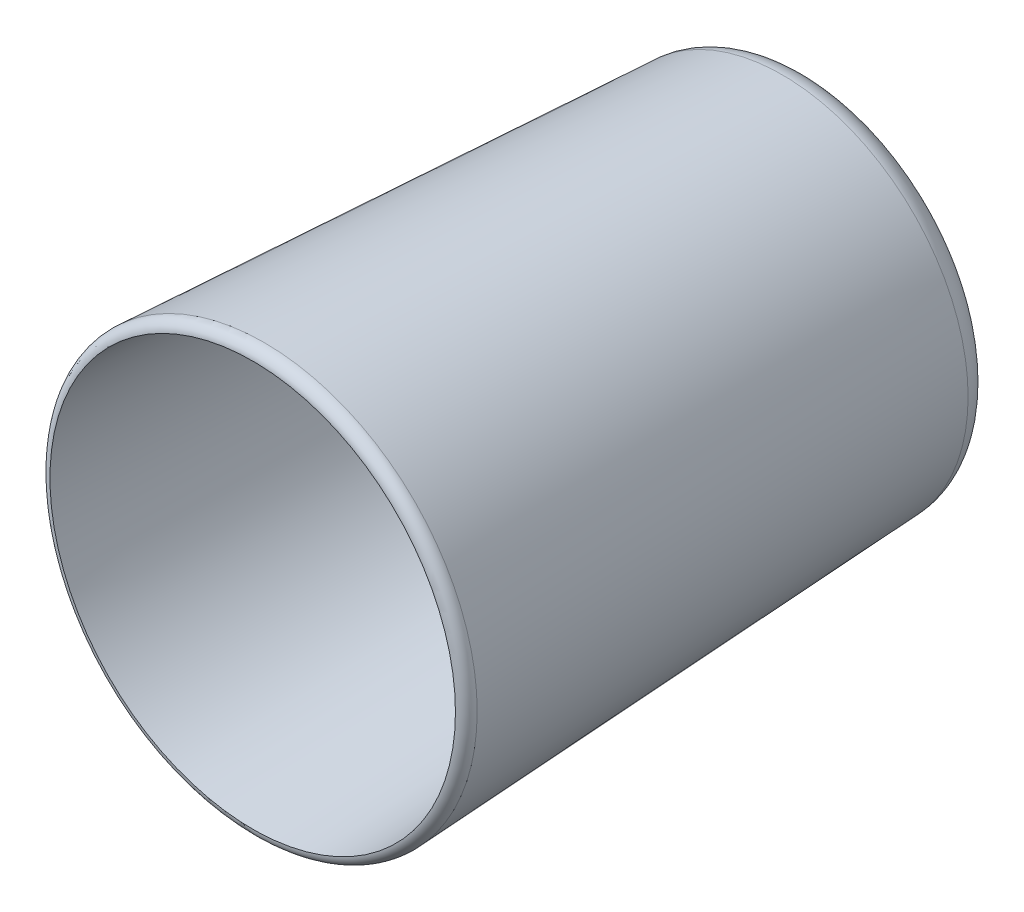
ISO-10303-21;
HEADER;
FILE_DESCRIPTION(('STEP AP214'),'2;1');
FILE_NAME('part.step','',(''),(''),'','','');
FILE_SCHEMA(('AUTOMOTIVE_DESIGN { 1 0 10303 214 1 1 1 1 }'));
ENDSEC;
DATA;
#1=APPLICATION_CONTEXT('core data for automotive mechanical design processes');
#2=APPLICATION_PROTOCOL_DEFINITION('international standard','automotive_design',2000,#1);
#3=PRODUCT_CONTEXT('',#1,'mechanical');
#4=PRODUCT('Part','Part','',(#3));
#5=PRODUCT_RELATED_PRODUCT_CATEGORY('part','',(#4));
#6=PRODUCT_DEFINITION_FORMATION('','',#4);
#7=PRODUCT_DEFINITION_CONTEXT('part definition',#1,'design');
#8=PRODUCT_DEFINITION('design','',#6,#7);
#9=PRODUCT_DEFINITION_SHAPE('','',#8);
#10=(LENGTH_UNIT() NAMED_UNIT(*) SI_UNIT(.MILLI.,.METRE.));
#11=(NAMED_UNIT(*) PLANE_ANGLE_UNIT() SI_UNIT($,.RADIAN.));
#12=(NAMED_UNIT(*) SI_UNIT($,.STERADIAN.) SOLID_ANGLE_UNIT());
#13=UNCERTAINTY_MEASURE_WITH_UNIT(LENGTH_MEASURE(1.E-05),#10,'distance_accuracy_value','');
#14=(GEOMETRIC_REPRESENTATION_CONTEXT(3) GLOBAL_UNCERTAINTY_ASSIGNED_CONTEXT((#13)) GLOBAL_UNIT_ASSIGNED_CONTEXT((#10,
#11,#12)) REPRESENTATION_CONTEXT('',''));
#15=CARTESIAN_POINT('',(0.,0.,0.));
#16=DIRECTION('',(0.,0.,1.));
#17=DIRECTION('',(1.,0.,0.));
#18=AXIS2_PLACEMENT_3D('',#15,#16,#17);
#19=CARTESIAN_POINT('',(0.,0.,-0.104671912485888));
#20=DIRECTION('',(0.,0.,1.));
#21=DIRECTION('',(1.,0.,0.));
#22=AXIS2_PLACEMENT_3D('',#19,#20,#21);
#23=CONICAL_SURFACE('',#22,33.9972590695091,0.0523598775598299);
#24=CARTESIAN_POINT('',(0.,0.,97.8980690180293));
#25=DIRECTION('',(0.,0.,-1.));
#26=DIRECTION('',(-1.,0.,0.));
#27=AXIS2_PLACEMENT_3D('',#24,#25,#26);
#28=CIRCLE('',#27,39.1333650853287);
#29=CARTESIAN_POINT('',(-39.1333650853287,0.,97.8980690180293));
#30=VERTEX_POINT('',#29);
#31=EDGE_CURVE('E10',#30,#30,#28,.T.);
#32=ORIENTED_EDGE('',*,*,#31,.T.);
#33=EDGE_LOOP('',(#32));
#34=FACE_BOUND('',#33,.T.);
#35=CARTESIAN_POINT('',(0.,0.,2.73832021878539));
#36=DIRECTION('',(0.,0.,-1.));
#37=DIRECTION('',(-1.,0.,0.));
#38=AXIS2_PLACEMENT_3D('',#35,#36,#37);
#39=CIRCLE('',#38,34.1462539736282);
#40=CARTESIAN_POINT('',(-34.1462539736282,0.,2.73832021878539));
#41=VERTEX_POINT('',#40);
#42=EDGE_CURVE('E43',#41,#41,#39,.F.);
#43=ORIENTED_EDGE('',*,*,#42,.T.);
#44=EDGE_LOOP('',(#43));
#45=FACE_BOUND('',#44,.T.);
#46=ADVANCED_FACE('F32',(#34,#45),#23,.T.);
#47=CARTESIAN_POINT('',(0.,0.,-2.));
#48=DIRECTION('',(0.,0.,1.));
#49=DIRECTION('',(1.,0.,0.));
#50=AXIS2_PLACEMENT_3D('',#47,#48,#49);
#51=PLANE('',#50);
#52=CARTESIAN_POINT('',(0.,0.,-2.));
#53=DIRECTION('',(0.,0.,1.));
#54=DIRECTION('',(1.,0.,0.));
#55=AXIS2_PLACEMENT_3D('',#52,#53,#54);
#56=CIRCLE('',#55,29.1531062998554);
#57=CARTESIAN_POINT('',(29.1531062998554,0.,-2.));
#58=VERTEX_POINT('',#57);
#59=EDGE_CURVE('E39',#58,#58,#56,.F.);
#60=ORIENTED_EDGE('',*,*,#59,.T.);
#61=EDGE_LOOP('',(#60));
#62=FACE_BOUND('',#61,.T.);
#63=ADVANCED_FACE('F60',(#62),#51,.F.);
#64=CARTESIAN_POINT('',(0.,0.,0.));
#65=DIRECTION('',(0.,0.,1.));
#66=DIRECTION('',(1.,0.,0.));
#67=AXIS2_PLACEMENT_3D('',#64,#65,#66);
#68=CONICAL_SURFACE('',#67,32.,0.0523598775598299);
#69=CARTESIAN_POINT('',(0.,0.,100.));
#70=DIRECTION('',(0.,0.,1.));
#71=DIRECTION('',(1.,0.,0.));
#72=AXIS2_PLACEMENT_3D('',#69,#70,#71);
#73=CIRCLE('',#72,37.2407779283041);
#74=CARTESIAN_POINT('',(37.2407779283041,0.,100.));
#75=VERTEX_POINT('',#74);
#76=EDGE_CURVE('E47',#75,#75,#73,.T.);
#77=ORIENTED_EDGE('',*,*,#76,.T.);
#78=EDGE_LOOP('',(#77));
#79=FACE_BOUND('',#78,.T.);
#80=CARTESIAN_POINT('',(0.,0.,0.));
#81=DIRECTION('',(0.,0.,1.));
#82=DIRECTION('',(1.,0.,0.));
#83=AXIS2_PLACEMENT_3D('',#80,#81,#82);
#84=CIRCLE('',#83,32.);
#85=CARTESIAN_POINT('',(32.,0.,0.));
#86=VERTEX_POINT('',#85);
#87=EDGE_CURVE('E52',#86,#86,#84,.T.);
#88=ORIENTED_EDGE('',*,*,#87,.F.);
#89=EDGE_LOOP('',(#88));
#90=FACE_BOUND('',#89,.T.);
#91=ADVANCED_FACE('F58',(#79,#90),#68,.F.);
#92=CARTESIAN_POINT('',(0.,0.,0.));
#93=DIRECTION('',(0.,0.,1.));
#94=DIRECTION('',(1.,0.,0.));
#95=AXIS2_PLACEMENT_3D('',#92,#93,#94);
#96=PLANE('',#95);
#97=ORIENTED_EDGE('',*,*,#87,.T.);
#98=EDGE_LOOP('',(#97));
#99=FACE_BOUND('',#98,.T.);
#100=ADVANCED_FACE('F56',(#99),#96,.T.);
#101=CARTESIAN_POINT('',(0.,0.,3.));
#102=DIRECTION('',(0.,0.,1.));
#103=DIRECTION('',(1.,0.,0.));
#104=AXIS2_PLACEMENT_3D('',#101,#102,#103);
#105=TOROIDAL_SURFACE('',#104,29.1531062998554,5.);
#106=ORIENTED_EDGE('',*,*,#59,.F.);
#107=EDGE_LOOP('',(#106));
#108=FACE_BOUND('',#107,.T.);
#109=ORIENTED_EDGE('',*,*,#42,.F.);
#110=EDGE_LOOP('',(#109));
#111=FACE_BOUND('',#110,.T.);
#112=ADVANCED_FACE('F67',(#108,#111),#105,.T.);
#113=CARTESIAN_POINT('',(0.,0.,98.0027409305151));
#114=DIRECTION('',(0.,0.,1.));
#115=DIRECTION('',(1.,0.,0.));
#116=AXIS2_PLACEMENT_3D('',#113,#114,#115);
#117=TOROIDAL_SURFACE('',#116,37.1361060158195,2.);
#118=ORIENTED_EDGE('',*,*,#31,.F.);
#119=EDGE_LOOP('',(#118));
#120=FACE_BOUND('',#119,.T.);
#121=ORIENTED_EDGE('',*,*,#76,.F.);
#122=EDGE_LOOP('',(#121));
#123=FACE_BOUND('',#122,.T.);
#124=ADVANCED_FACE('F34',(#120,#123),#117,.T.);
#125=CLOSED_SHELL('',(#46,#63,#91,#100,#112,#124));
#126=MANIFOLD_SOLID_BREP('B2',#125);
#127=ADVANCED_BREP_SHAPE_REPRESENTATION('',(#18,#126),#14);
#128=SHAPE_DEFINITION_REPRESENTATION(#9,#127);
ENDSEC;
END-ISO-10303-21;
